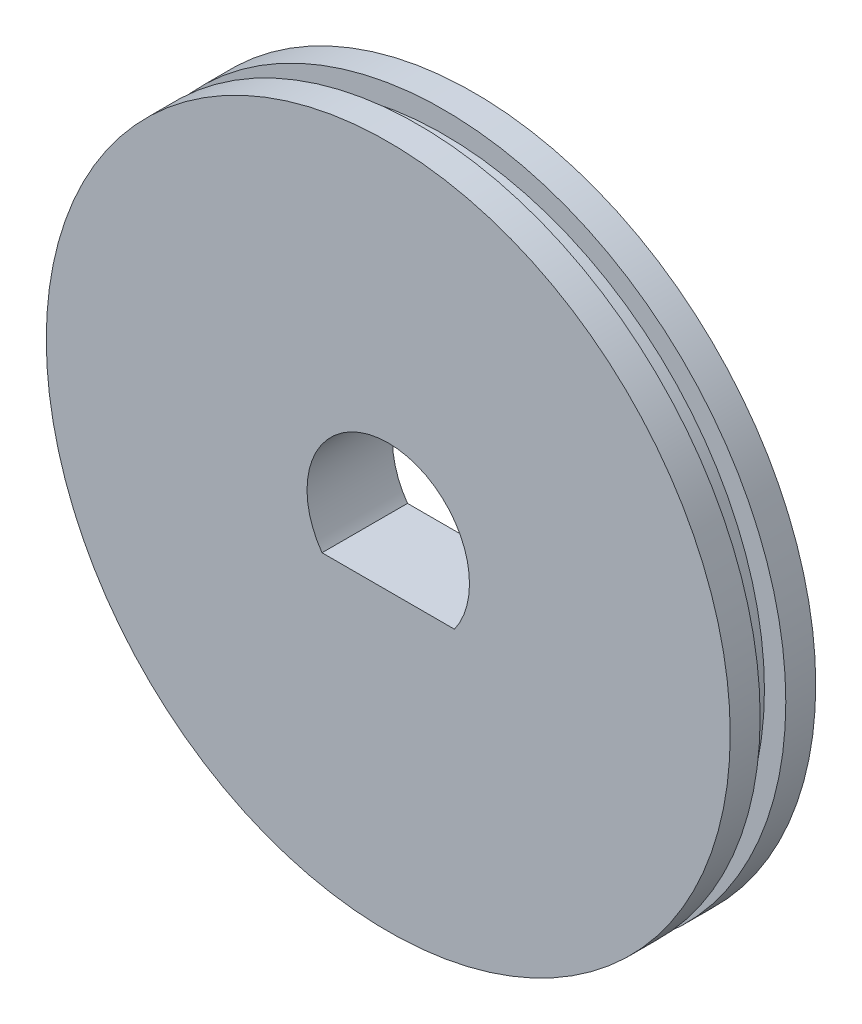
ISO-10303-21;
HEADER;
FILE_DESCRIPTION(('STEP AP214'),'2;1');
FILE_NAME('part.step','',(''),(''),'','','');
FILE_SCHEMA(('AUTOMOTIVE_DESIGN { 1 0 10303 214 1 1 1 1 }'));
ENDSEC;
DATA;
#1=APPLICATION_CONTEXT('core data for automotive mechanical design processes');
#2=APPLICATION_PROTOCOL_DEFINITION('international standard','automotive_design',2000,#1);
#3=PRODUCT_CONTEXT('',#1,'mechanical');
#4=PRODUCT('Part','Part','',(#3));
#5=PRODUCT_RELATED_PRODUCT_CATEGORY('part','',(#4));
#6=PRODUCT_DEFINITION_FORMATION('','',#4);
#7=PRODUCT_DEFINITION_CONTEXT('part definition',#1,'design');
#8=PRODUCT_DEFINITION('design','',#6,#7);
#9=PRODUCT_DEFINITION_SHAPE('','',#8);
#10=(LENGTH_UNIT() NAMED_UNIT(*) SI_UNIT(.MILLI.,.METRE.));
#11=(NAMED_UNIT(*) PLANE_ANGLE_UNIT() SI_UNIT($,.RADIAN.));
#12=(NAMED_UNIT(*) SI_UNIT($,.STERADIAN.) SOLID_ANGLE_UNIT());
#13=UNCERTAINTY_MEASURE_WITH_UNIT(LENGTH_MEASURE(1.E-05),#10,'distance_accuracy_value','');
#14=(GEOMETRIC_REPRESENTATION_CONTEXT(3) GLOBAL_UNCERTAINTY_ASSIGNED_CONTEXT((#13)) GLOBAL_UNIT_ASSIGNED_CONTEXT((#10,
#11,#12)) REPRESENTATION_CONTEXT('',''));
#15=CARTESIAN_POINT('',(0.,0.,0.));
#16=DIRECTION('',(0.,0.,1.));
#17=DIRECTION('',(1.,0.,0.));
#18=AXIS2_PLACEMENT_3D('',#15,#16,#17);
#19=CARTESIAN_POINT('',(0.,0.,2.));
#20=DIRECTION('',(0.,0.,-1.));
#21=DIRECTION('',(-1.,0.,0.));
#22=AXIS2_PLACEMENT_3D('',#19,#20,#21);
#23=CYLINDRICAL_SURFACE('',#22,8.);
#24=CARTESIAN_POINT('',(0.,0.,0.));
#25=DIRECTION('',(0.,0.,1.));
#26=DIRECTION('',(1.,0.,0.));
#27=AXIS2_PLACEMENT_3D('',#24,#25,#26);
#28=CIRCLE('',#27,8.);
#29=CARTESIAN_POINT('',(8.,0.,0.));
#30=VERTEX_POINT('',#29);
#31=EDGE_CURVE('E47',#30,#30,#28,.T.);
#32=ORIENTED_EDGE('',*,*,#31,.T.);
#33=EDGE_LOOP('',(#32));
#34=FACE_BOUND('',#33,.T.);
#35=CARTESIAN_POINT('',(0.,0.,0.7));
#36=DIRECTION('',(0.,0.,1.));
#37=DIRECTION('',(1.,0.,0.));
#38=AXIS2_PLACEMENT_3D('',#35,#36,#37);
#39=CIRCLE('',#38,8.);
#40=CARTESIAN_POINT('',(8.,0.,0.7));
#41=VERTEX_POINT('',#40);
#42=EDGE_CURVE('E82',#41,#41,#39,.T.);
#43=ORIENTED_EDGE('',*,*,#42,.F.);
#44=EDGE_LOOP('',(#43));
#45=FACE_BOUND('',#44,.T.);
#46=ADVANCED_FACE('F44',(#34,#45),#23,.T.);
#47=CARTESIAN_POINT('',(0.,0.,2.));
#48=DIRECTION('',(0.,0.,1.));
#49=DIRECTION('',(1.,0.,0.));
#50=AXIS2_PLACEMENT_3D('',#47,#48,#49);
#51=CIRCLE('',#50,8.);
#52=CARTESIAN_POINT('',(8.,0.,2.));
#53=VERTEX_POINT('',#52);
#54=EDGE_CURVE('E13',#53,#53,#51,.T.);
#55=ORIENTED_EDGE('',*,*,#54,.F.);
#56=EDGE_LOOP('',(#55));
#57=FACE_BOUND('',#56,.T.);
#58=CARTESIAN_POINT('',(0.,0.,1.3));
#59=DIRECTION('',(0.,0.,1.));
#60=DIRECTION('',(1.,0.,0.));
#61=AXIS2_PLACEMENT_3D('',#58,#59,#60);
#62=CIRCLE('',#61,8.);
#63=CARTESIAN_POINT('',(8.,0.,1.3));
#64=VERTEX_POINT('',#63);
#65=EDGE_CURVE('E97',#64,#64,#62,.T.);
#66=ORIENTED_EDGE('',*,*,#65,.T.);
#67=EDGE_LOOP('',(#66));
#68=FACE_BOUND('',#67,.T.);
#69=ADVANCED_FACE('F101',(#57,#68),#23,.T.);
#70=CARTESIAN_POINT('',(0.,0.,2.));
#71=DIRECTION('',(0.,0.,1.));
#72=DIRECTION('',(1.,0.,0.));
#73=AXIS2_PLACEMENT_3D('',#70,#71,#72);
#74=PLANE('',#73);
#75=ORIENTED_EDGE('',*,*,#54,.T.);
#76=EDGE_LOOP('',(#75));
#77=FACE_BOUND('',#76,.T.);
#78=DIRECTION('',(1.,0.,0.));
#79=VECTOR('',#78,1.);
#80=CARTESIAN_POINT('',(-1.54919333848297,-1.1,2.));
#81=LINE('',#80,#79);
#82=CARTESIAN_POINT('',(-1.54919333848297,-1.1,2.));
#83=VERTEX_POINT('',#82);
#84=CARTESIAN_POINT('',(1.54919333848297,-1.1,2.));
#85=VERTEX_POINT('',#84);
#86=EDGE_CURVE('E88',#83,#85,#81,.T.);
#87=ORIENTED_EDGE('',*,*,#86,.F.);
#88=CARTESIAN_POINT('',(0.,0.,2.));
#89=DIRECTION('',(0.,0.,1.));
#90=DIRECTION('',(1.,0.,0.));
#91=AXIS2_PLACEMENT_3D('',#88,#89,#90);
#92=CIRCLE('',#91,1.9);
#93=EDGE_CURVE('E75',#85,#83,#92,.T.);
#94=ORIENTED_EDGE('',*,*,#93,.F.);
#95=EDGE_LOOP('',(#87,#94));
#96=FACE_BOUND('',#95,.T.);
#97=ADVANCED_FACE('F119',(#77,#96),#74,.T.);
#98=CARTESIAN_POINT('',(0.,0.,0.));
#99=DIRECTION('',(0.,0.,1.));
#100=DIRECTION('',(1.,0.,0.));
#101=AXIS2_PLACEMENT_3D('',#98,#99,#100);
#102=PLANE('',#101);
#103=ORIENTED_EDGE('',*,*,#31,.F.);
#104=EDGE_LOOP('',(#103));
#105=FACE_BOUND('',#104,.T.);
#106=CARTESIAN_POINT('',(0.,0.,0.));
#107=DIRECTION('',(0.,0.,1.));
#108=DIRECTION('',(1.,0.,0.));
#109=AXIS2_PLACEMENT_3D('',#106,#107,#108);
#110=CIRCLE('',#109,1.9);
#111=CARTESIAN_POINT('',(1.54919333848297,-1.1,0.));
#112=VERTEX_POINT('',#111);
#113=CARTESIAN_POINT('',(-1.54919333848297,-1.1,0.));
#114=VERTEX_POINT('',#113);
#115=EDGE_CURVE('E65',#112,#114,#110,.T.);
#116=ORIENTED_EDGE('',*,*,#115,.T.);
#117=DIRECTION('',(1.,0.,0.));
#118=VECTOR('',#117,1.);
#119=CARTESIAN_POINT('',(-1.54919333848297,-1.1,0.));
#120=LINE('',#119,#118);
#121=EDGE_CURVE('E71',#114,#112,#120,.T.);
#122=ORIENTED_EDGE('',*,*,#121,.T.);
#123=EDGE_LOOP('',(#116,#122));
#124=FACE_BOUND('',#123,.T.);
#125=ADVANCED_FACE('F81',(#105,#124),#102,.F.);
#126=CARTESIAN_POINT('',(0.,0.,2.));
#127=DIRECTION('',(0.,0.,-1.));
#128=DIRECTION('',(-1.,0.,0.));
#129=AXIS2_PLACEMENT_3D('',#126,#127,#128);
#130=CYLINDRICAL_SURFACE('',#129,1.9);
#131=ORIENTED_EDGE('',*,*,#115,.F.);
#132=DIRECTION('',(0.,0.,-1.));
#133=VECTOR('',#132,1.);
#134=CARTESIAN_POINT('',(1.54919333848297,-1.1,2.));
#135=LINE('',#134,#133);
#136=EDGE_CURVE('E73',#85,#112,#135,.T.);
#137=ORIENTED_EDGE('',*,*,#136,.F.);
#138=ORIENTED_EDGE('',*,*,#93,.T.);
#139=DIRECTION('',(0.,0.,-1.));
#140=VECTOR('',#139,1.);
#141=CARTESIAN_POINT('',(-1.54919333848297,-1.1,2.));
#142=LINE('',#141,#140);
#143=EDGE_CURVE('E58',#83,#114,#142,.T.);
#144=ORIENTED_EDGE('',*,*,#143,.T.);
#145=EDGE_LOOP('',(#131,#137,#138,#144));
#146=FACE_BOUND('',#145,.T.);
#147=ADVANCED_FACE('F77',(#146),#130,.F.);
#148=CARTESIAN_POINT('',(-1.54919333848297,-1.1,2.));
#149=DIRECTION('',(0.,1.,0.));
#150=DIRECTION('',(0.,0.,1.));
#151=AXIS2_PLACEMENT_3D('',#148,#149,#150);
#152=PLANE('',#151);
#153=ORIENTED_EDGE('',*,*,#121,.F.);
#154=ORIENTED_EDGE('',*,*,#143,.F.);
#155=ORIENTED_EDGE('',*,*,#86,.T.);
#156=ORIENTED_EDGE('',*,*,#136,.T.);
#157=EDGE_LOOP('',(#153,#154,#155,#156));
#158=FACE_BOUND('',#157,.T.);
#159=ADVANCED_FACE('F72',(#158),#152,.T.);
#160=CARTESIAN_POINT('',(-8.,0.,0.7));
#161=DIRECTION('',(0.,0.,1.));
#162=DIRECTION('',(1.,0.,0.));
#163=AXIS2_PLACEMENT_3D('',#160,#161,#162);
#164=PLANE('',#163);
#165=ORIENTED_EDGE('',*,*,#42,.T.);
#166=EDGE_LOOP('',(#165));
#167=FACE_BOUND('',#166,.T.);
#168=CARTESIAN_POINT('',(0.,0.,0.7));
#169=DIRECTION('',(0.,0.,1.));
#170=DIRECTION('',(1.,0.,0.));
#171=AXIS2_PLACEMENT_3D('',#168,#169,#170);
#172=CIRCLE('',#171,7.5);
#173=CARTESIAN_POINT('',(7.5,0.,0.7));
#174=VERTEX_POINT('',#173);
#175=EDGE_CURVE('E85',#174,#174,#172,.T.);
#176=ORIENTED_EDGE('',*,*,#175,.F.);
#177=EDGE_LOOP('',(#176));
#178=FACE_BOUND('',#177,.T.);
#179=ADVANCED_FACE('F111',(#167,#178),#164,.T.);
#180=CARTESIAN_POINT('',(0.,0.,2.));
#181=DIRECTION('',(0.,0.,1.));
#182=DIRECTION('',(1.,0.,0.));
#183=AXIS2_PLACEMENT_3D('',#180,#181,#182);
#184=CYLINDRICAL_SURFACE('',#183,7.5);
#185=ORIENTED_EDGE('',*,*,#175,.T.);
#186=EDGE_LOOP('',(#185));
#187=FACE_BOUND('',#186,.T.);
#188=CARTESIAN_POINT('',(0.,0.,1.3));
#189=DIRECTION('',(0.,0.,1.));
#190=DIRECTION('',(1.,0.,0.));
#191=AXIS2_PLACEMENT_3D('',#188,#189,#190);
#192=CIRCLE('',#191,7.5);
#193=CARTESIAN_POINT('',(7.5,0.,1.3));
#194=VERTEX_POINT('',#193);
#195=EDGE_CURVE('E94',#194,#194,#192,.T.);
#196=ORIENTED_EDGE('',*,*,#195,.F.);
#197=EDGE_LOOP('',(#196));
#198=FACE_BOUND('',#197,.T.);
#199=ADVANCED_FACE('F105',(#187,#198),#184,.T.);
#200=CARTESIAN_POINT('',(-7.5,0.,1.3));
#201=DIRECTION('',(0.,0.,-1.));
#202=DIRECTION('',(-1.,0.,0.));
#203=AXIS2_PLACEMENT_3D('',#200,#201,#202);
#204=PLANE('',#203);
#205=ORIENTED_EDGE('',*,*,#195,.T.);
#206=EDGE_LOOP('',(#205));
#207=FACE_BOUND('',#206,.T.);
#208=ORIENTED_EDGE('',*,*,#65,.F.);
#209=EDGE_LOOP('',(#208));
#210=FACE_BOUND('',#209,.T.);
#211=ADVANCED_FACE('F103',(#207,#210),#204,.T.);
#212=CLOSED_SHELL('',(#46,#69,#97,#125,#147,#159,#179,#199,#211));
#213=MANIFOLD_SOLID_BREP('B2',#212);
#214=ADVANCED_BREP_SHAPE_REPRESENTATION('',(#18,#213),#14);
#215=SHAPE_DEFINITION_REPRESENTATION(#9,#214);
ENDSEC;
END-ISO-10303-21;
